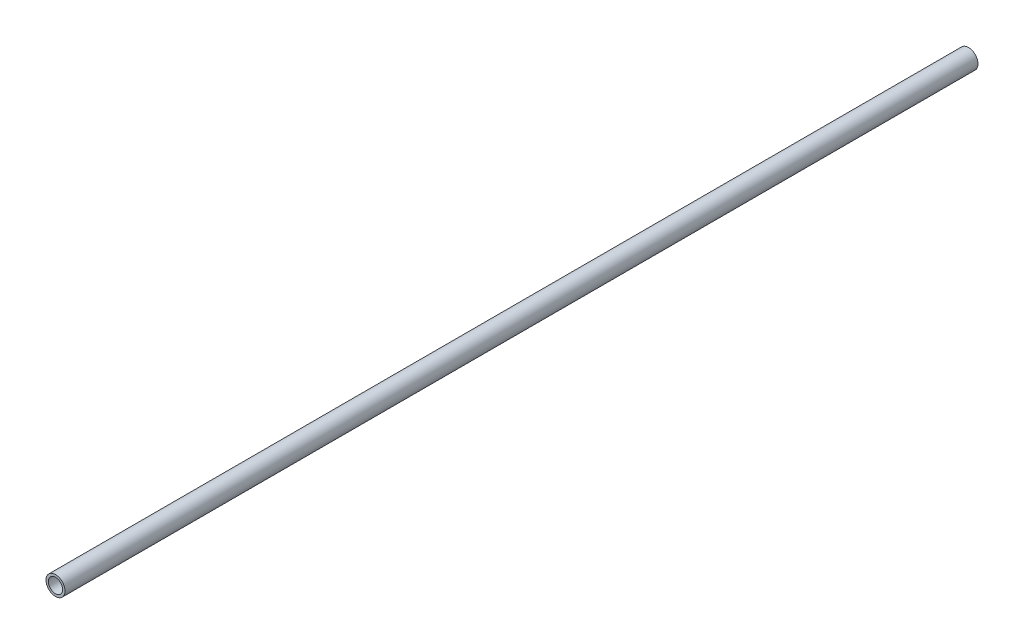
ISO-10303-21;
HEADER;
FILE_DESCRIPTION(('STEP AP214'),'2;1');
FILE_NAME('part.step','',(''),(''),'','','');
FILE_SCHEMA(('AUTOMOTIVE_DESIGN { 1 0 10303 214 1 1 1 1 }'));
ENDSEC;
DATA;
#1=APPLICATION_CONTEXT('core data for automotive mechanical design processes');
#2=APPLICATION_PROTOCOL_DEFINITION('international standard','automotive_design',2000,#1);
#3=PRODUCT_CONTEXT('',#1,'mechanical');
#4=PRODUCT('Part','Part','',(#3));
#5=PRODUCT_RELATED_PRODUCT_CATEGORY('part','',(#4));
#6=PRODUCT_DEFINITION_FORMATION('','',#4);
#7=PRODUCT_DEFINITION_CONTEXT('part definition',#1,'design');
#8=PRODUCT_DEFINITION('design','',#6,#7);
#9=PRODUCT_DEFINITION_SHAPE('','',#8);
#10=(LENGTH_UNIT() NAMED_UNIT(*) SI_UNIT(.MILLI.,.METRE.));
#11=(NAMED_UNIT(*) PLANE_ANGLE_UNIT() SI_UNIT($,.RADIAN.));
#12=(NAMED_UNIT(*) SI_UNIT($,.STERADIAN.) SOLID_ANGLE_UNIT());
#13=UNCERTAINTY_MEASURE_WITH_UNIT(LENGTH_MEASURE(1.E-05),#10,'distance_accuracy_value','');
#14=(GEOMETRIC_REPRESENTATION_CONTEXT(3) GLOBAL_UNCERTAINTY_ASSIGNED_CONTEXT((#13)) GLOBAL_UNIT_ASSIGNED_CONTEXT((#10,
#11,#12)) REPRESENTATION_CONTEXT('',''));
#15=CARTESIAN_POINT('',(0.,0.,0.));
#16=DIRECTION('',(0.,0.,1.));
#17=DIRECTION('',(1.,0.,0.));
#18=AXIS2_PLACEMENT_3D('',#15,#16,#17);
#19=CARTESIAN_POINT('',(0.,0.,914.4));
#20=DIRECTION('',(0.,0.,1.));
#21=DIRECTION('',(1.,0.,0.));
#22=AXIS2_PLACEMENT_3D('',#19,#20,#21);
#23=PLANE('',#22);
#24=CARTESIAN_POINT('',(0.,0.,914.4));
#25=DIRECTION('',(0.,0.,1.));
#26=DIRECTION('',(1.,0.,0.));
#27=AXIS2_PLACEMENT_3D('',#24,#25,#26);
#28=CIRCLE('',#27,9.525);
#29=CARTESIAN_POINT('',(9.525,0.,914.4));
#30=VERTEX_POINT('',#29);
#31=EDGE_CURVE('E10',#30,#30,#28,.T.);
#32=ORIENTED_EDGE('',*,*,#31,.T.);
#33=EDGE_LOOP('',(#32));
#34=FACE_BOUND('',#33,.T.);
#35=CARTESIAN_POINT('',(0.,0.,914.4));
#36=DIRECTION('',(0.,0.,1.));
#37=DIRECTION('',(1.,0.,0.));
#38=AXIS2_PLACEMENT_3D('',#35,#36,#37);
#39=CIRCLE('',#38,7.14375);
#40=CARTESIAN_POINT('',(7.14375,0.,914.4));
#41=VERTEX_POINT('',#40);
#42=EDGE_CURVE('E48',#41,#41,#39,.T.);
#43=ORIENTED_EDGE('',*,*,#42,.F.);
#44=EDGE_LOOP('',(#43));
#45=FACE_BOUND('',#44,.T.);
#46=ADVANCED_FACE('F37',(#34,#45),#23,.T.);
#47=CARTESIAN_POINT('',(0.,0.,0.));
#48=DIRECTION('',(0.,0.,1.));
#49=DIRECTION('',(1.,0.,0.));
#50=AXIS2_PLACEMENT_3D('',#47,#48,#49);
#51=PLANE('',#50);
#52=CARTESIAN_POINT('',(0.,0.,0.));
#53=DIRECTION('',(0.,0.,1.));
#54=DIRECTION('',(1.,0.,0.));
#55=AXIS2_PLACEMENT_3D('',#52,#53,#54);
#56=CIRCLE('',#55,9.525);
#57=CARTESIAN_POINT('',(9.525,0.,0.));
#58=VERTEX_POINT('',#57);
#59=EDGE_CURVE('E41',#58,#58,#56,.T.);
#60=ORIENTED_EDGE('',*,*,#59,.F.);
#61=EDGE_LOOP('',(#60));
#62=FACE_BOUND('',#61,.T.);
#63=CARTESIAN_POINT('',(0.,0.,0.));
#64=DIRECTION('',(0.,0.,1.));
#65=DIRECTION('',(1.,0.,0.));
#66=AXIS2_PLACEMENT_3D('',#63,#64,#65);
#67=CIRCLE('',#66,7.14375);
#68=CARTESIAN_POINT('',(7.14375,0.,0.));
#69=VERTEX_POINT('',#68);
#70=EDGE_CURVE('E50',#69,#69,#67,.T.);
#71=ORIENTED_EDGE('',*,*,#70,.T.);
#72=EDGE_LOOP('',(#71));
#73=FACE_BOUND('',#72,.T.);
#74=ADVANCED_FACE('F60',(#62,#73),#51,.F.);
#75=CARTESIAN_POINT('',(0.,0.,914.4));
#76=DIRECTION('',(0.,0.,-1.));
#77=DIRECTION('',(-1.,0.,0.));
#78=AXIS2_PLACEMENT_3D('',#75,#76,#77);
#79=CYLINDRICAL_SURFACE('',#78,9.525);
#80=ORIENTED_EDGE('',*,*,#31,.F.);
#81=EDGE_LOOP('',(#80));
#82=FACE_BOUND('',#81,.T.);
#83=ORIENTED_EDGE('',*,*,#59,.T.);
#84=EDGE_LOOP('',(#83));
#85=FACE_BOUND('',#84,.T.);
#86=ADVANCED_FACE('F39',(#82,#85),#79,.T.);
#87=CARTESIAN_POINT('',(0.,0.,914.4));
#88=DIRECTION('',(0.,0.,-1.));
#89=DIRECTION('',(-1.,0.,0.));
#90=AXIS2_PLACEMENT_3D('',#87,#88,#89);
#91=CYLINDRICAL_SURFACE('',#90,7.14375);
#92=ORIENTED_EDGE('',*,*,#42,.T.);
#93=EDGE_LOOP('',(#92));
#94=FACE_BOUND('',#93,.T.);
#95=ORIENTED_EDGE('',*,*,#70,.F.);
#96=EDGE_LOOP('',(#95));
#97=FACE_BOUND('',#96,.T.);
#98=ADVANCED_FACE('F56',(#94,#97),#91,.F.);
#99=CLOSED_SHELL('',(#46,#74,#86,#98));
#100=MANIFOLD_SOLID_BREP('B2',#99);
#101=ADVANCED_BREP_SHAPE_REPRESENTATION('',(#18,#100),#14);
#102=SHAPE_DEFINITION_REPRESENTATION(#9,#101);
ENDSEC;
END-ISO-10303-21;
